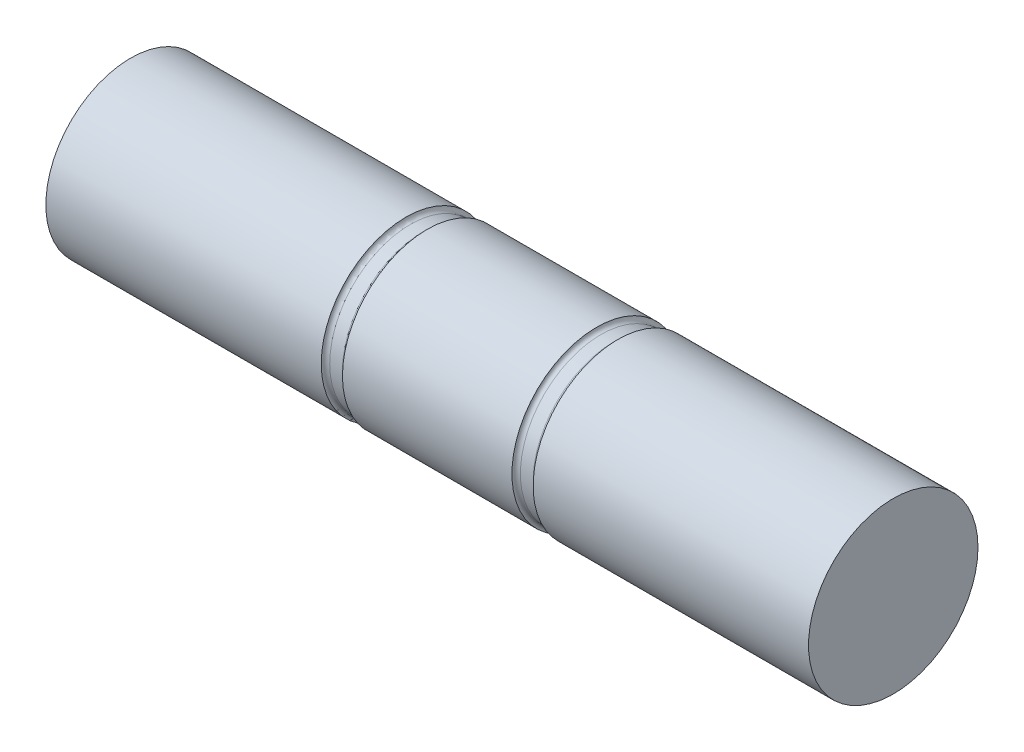
ISO-10303-21;
HEADER;
FILE_DESCRIPTION(('STEP AP214'),'2;1');
FILE_NAME('part.step','',(''),(''),'','','');
FILE_SCHEMA(('AUTOMOTIVE_DESIGN { 1 0 10303 214 1 1 1 1 }'));
ENDSEC;
DATA;
#1=APPLICATION_CONTEXT('core data for automotive mechanical design processes');
#2=APPLICATION_PROTOCOL_DEFINITION('international standard','automotive_design',2000,#1);
#3=PRODUCT_CONTEXT('',#1,'mechanical');
#4=PRODUCT('Part','Part','',(#3));
#5=PRODUCT_RELATED_PRODUCT_CATEGORY('part','',(#4));
#6=PRODUCT_DEFINITION_FORMATION('','',#4);
#7=PRODUCT_DEFINITION_CONTEXT('part definition',#1,'design');
#8=PRODUCT_DEFINITION('design','',#6,#7);
#9=PRODUCT_DEFINITION_SHAPE('','',#8);
#10=(LENGTH_UNIT() NAMED_UNIT(*) SI_UNIT(.MILLI.,.METRE.));
#11=(NAMED_UNIT(*) PLANE_ANGLE_UNIT() SI_UNIT($,.RADIAN.));
#12=(NAMED_UNIT(*) SI_UNIT($,.STERADIAN.) SOLID_ANGLE_UNIT());
#13=UNCERTAINTY_MEASURE_WITH_UNIT(LENGTH_MEASURE(1.E-05),#10,'distance_accuracy_value','');
#14=(GEOMETRIC_REPRESENTATION_CONTEXT(3) GLOBAL_UNCERTAINTY_ASSIGNED_CONTEXT((#13)) GLOBAL_UNIT_ASSIGNED_CONTEXT((#10,
#11,#12)) REPRESENTATION_CONTEXT('',''));
#15=CARTESIAN_POINT('',(0.,0.,0.));
#16=DIRECTION('',(0.,0.,1.));
#17=DIRECTION('',(1.,0.,0.));
#18=AXIS2_PLACEMENT_3D('',#15,#16,#17);
#19=CARTESIAN_POINT('',(18.,0.,0.));
#20=DIRECTION('',(-1.,0.,0.));
#21=DIRECTION('',(0.,0.,1.));
#22=AXIS2_PLACEMENT_3D('',#19,#20,#21);
#23=CYLINDRICAL_SURFACE('',#22,2.);
#24=CARTESIAN_POINT('',(11.,0.,0.));
#25=DIRECTION('',(1.,0.,0.));
#26=DIRECTION('',(0.,0.,-1.));
#27=AXIS2_PLACEMENT_3D('',#24,#25,#26);
#28=CIRCLE('',#27,2.);
#29=CARTESIAN_POINT('',(11.,0.,-2.));
#30=VERTEX_POINT('',#29);
#31=EDGE_CURVE('E78',#30,#30,#28,.T.);
#32=ORIENTED_EDGE('',*,*,#31,.F.);
#33=EDGE_LOOP('',(#32));
#34=FACE_BOUND('',#33,.T.);
#35=CARTESIAN_POINT('',(7.,0.,0.));
#36=DIRECTION('',(1.,0.,0.));
#37=DIRECTION('',(0.,0.,-1.));
#38=AXIS2_PLACEMENT_3D('',#35,#36,#37);
#39=CIRCLE('',#38,2.);
#40=CARTESIAN_POINT('',(7.,0.,-2.));
#41=VERTEX_POINT('',#40);
#42=EDGE_CURVE('E86',#41,#41,#39,.T.);
#43=ORIENTED_EDGE('',*,*,#42,.T.);
#44=EDGE_LOOP('',(#43));
#45=FACE_BOUND('',#44,.T.);
#46=ADVANCED_FACE('F45',(#34,#45),#23,.T.);
#47=CARTESIAN_POINT('',(11.,0.,0.));
#48=DIRECTION('',(1.,0.,0.));
#49=DIRECTION('',(0.,0.,-1.));
#50=AXIS2_PLACEMENT_3D('',#47,#48,#49);
#51=CYLINDRICAL_SURFACE('',#50,1.9);
#52=CARTESIAN_POINT('',(11.1,0.,0.));
#53=DIRECTION('',(1.,0.,0.));
#54=DIRECTION('',(0.,0.,-1.));
#55=AXIS2_PLACEMENT_3D('',#52,#53,#54);
#56=CIRCLE('',#55,1.9);
#57=CARTESIAN_POINT('',(11.1,0.,-1.9));
#58=VERTEX_POINT('',#57);
#59=EDGE_CURVE('E10',#58,#58,#56,.T.);
#60=ORIENTED_EDGE('',*,*,#59,.T.);
#61=EDGE_LOOP('',(#60));
#62=FACE_BOUND('',#61,.T.);
#63=CARTESIAN_POINT('',(11.4,0.,0.));
#64=DIRECTION('',(1.,0.,0.));
#65=DIRECTION('',(0.,0.,-1.));
#66=AXIS2_PLACEMENT_3D('',#63,#64,#65);
#67=CIRCLE('',#66,1.9);
#68=CARTESIAN_POINT('',(11.4,0.,-1.9));
#69=VERTEX_POINT('',#68);
#70=EDGE_CURVE('E53',#69,#69,#67,.F.);
#71=ORIENTED_EDGE('',*,*,#70,.T.);
#72=EDGE_LOOP('',(#71));
#73=FACE_BOUND('',#72,.T.);
#74=ADVANCED_FACE('F121',(#62,#73),#51,.T.);
#75=CARTESIAN_POINT('',(18.,0.,0.));
#76=DIRECTION('',(1.,0.,0.));
#77=DIRECTION('',(0.,0.,-1.));
#78=AXIS2_PLACEMENT_3D('',#75,#76,#77);
#79=PLANE('',#78);
#80=CARTESIAN_POINT('',(18.,0.,0.));
#81=DIRECTION('',(1.,0.,0.));
#82=DIRECTION('',(0.,0.,-1.));
#83=AXIS2_PLACEMENT_3D('',#80,#81,#82);
#84=CIRCLE('',#83,2.);
#85=CARTESIAN_POINT('',(18.,0.,-2.));
#86=VERTEX_POINT('',#85);
#87=EDGE_CURVE('E73',#86,#86,#84,.T.);
#88=ORIENTED_EDGE('',*,*,#87,.T.);
#89=EDGE_LOOP('',(#88));
#90=FACE_BOUND('',#89,.T.);
#91=ADVANCED_FACE('F127',(#90),#79,.T.);
#92=CARTESIAN_POINT('',(11.5,0.,0.));
#93=DIRECTION('',(1.,0.,0.));
#94=DIRECTION('',(0.,0.,-1.));
#95=AXIS2_PLACEMENT_3D('',#92,#93,#94);
#96=CIRCLE('',#95,2.);
#97=CARTESIAN_POINT('',(11.5,0.,-2.));
#98=VERTEX_POINT('',#97);
#99=EDGE_CURVE('E82',#98,#98,#96,.T.);
#100=ORIENTED_EDGE('',*,*,#99,.T.);
#101=EDGE_LOOP('',(#100));
#102=FACE_BOUND('',#101,.T.);
#103=ORIENTED_EDGE('',*,*,#87,.F.);
#104=EDGE_LOOP('',(#103));
#105=FACE_BOUND('',#104,.T.);
#106=ADVANCED_FACE('F118',(#102,#105),#23,.T.);
#107=CARTESIAN_POINT('',(7.,0.,0.));
#108=DIRECTION('',(-1.,0.,0.));
#109=DIRECTION('',(0.,0.,1.));
#110=AXIS2_PLACEMENT_3D('',#107,#108,#109);
#111=CYLINDRICAL_SURFACE('',#110,1.9);
#112=CARTESIAN_POINT('',(6.9,0.,0.));
#113=DIRECTION('',(-1.,0.,0.));
#114=DIRECTION('',(0.,0.,1.));
#115=AXIS2_PLACEMENT_3D('',#112,#113,#114);
#116=CIRCLE('',#115,1.9);
#117=CARTESIAN_POINT('',(6.9,0.,1.9));
#118=VERTEX_POINT('',#117);
#119=EDGE_CURVE('E60',#118,#118,#116,.T.);
#120=ORIENTED_EDGE('',*,*,#119,.T.);
#121=EDGE_LOOP('',(#120));
#122=FACE_BOUND('',#121,.T.);
#123=CARTESIAN_POINT('',(6.6,0.,0.));
#124=DIRECTION('',(-1.,0.,0.));
#125=DIRECTION('',(0.,0.,1.));
#126=AXIS2_PLACEMENT_3D('',#123,#124,#125);
#127=CIRCLE('',#126,1.9);
#128=CARTESIAN_POINT('',(6.6,0.,1.9));
#129=VERTEX_POINT('',#128);
#130=EDGE_CURVE('E67',#129,#129,#127,.F.);
#131=ORIENTED_EDGE('',*,*,#130,.T.);
#132=EDGE_LOOP('',(#131));
#133=FACE_BOUND('',#132,.T.);
#134=ADVANCED_FACE('F131',(#122,#133),#111,.T.);
#135=CARTESIAN_POINT('',(0.,0.,0.));
#136=DIRECTION('',(1.,0.,0.));
#137=DIRECTION('',(0.,0.,-1.));
#138=AXIS2_PLACEMENT_3D('',#135,#136,#137);
#139=PLANE('',#138);
#140=CARTESIAN_POINT('',(0.,0.,0.));
#141=DIRECTION('',(1.,0.,0.));
#142=DIRECTION('',(0.,0.,-1.));
#143=AXIS2_PLACEMENT_3D('',#140,#141,#142);
#144=CIRCLE('',#143,2.);
#145=CARTESIAN_POINT('',(0.,0.,-2.));
#146=VERTEX_POINT('',#145);
#147=EDGE_CURVE('E74',#146,#146,#144,.T.);
#148=ORIENTED_EDGE('',*,*,#147,.F.);
#149=EDGE_LOOP('',(#148));
#150=FACE_BOUND('',#149,.T.);
#151=ADVANCED_FACE('F115',(#150),#139,.F.);
#152=CARTESIAN_POINT('',(6.5,0.,0.));
#153=DIRECTION('',(1.,0.,0.));
#154=DIRECTION('',(0.,0.,-1.));
#155=AXIS2_PLACEMENT_3D('',#152,#153,#154);
#156=CIRCLE('',#155,2.);
#157=CARTESIAN_POINT('',(6.5,0.,-2.));
#158=VERTEX_POINT('',#157);
#159=EDGE_CURVE('E90',#158,#158,#156,.T.);
#160=ORIENTED_EDGE('',*,*,#159,.F.);
#161=EDGE_LOOP('',(#160));
#162=FACE_BOUND('',#161,.T.);
#163=ORIENTED_EDGE('',*,*,#147,.T.);
#164=EDGE_LOOP('',(#163));
#165=FACE_BOUND('',#164,.T.);
#166=ADVANCED_FACE('F104',(#162,#165),#23,.T.);
#167=CARTESIAN_POINT('',(6.9,0.,0.));
#168=DIRECTION('',(-1.,0.,0.));
#169=DIRECTION('',(0.,0.,1.));
#170=AXIS2_PLACEMENT_3D('',#167,#168,#169);
#171=TOROIDAL_SURFACE('',#170,2.,0.1);
#172=ORIENTED_EDGE('',*,*,#119,.F.);
#173=EDGE_LOOP('',(#172));
#174=FACE_BOUND('',#173,.T.);
#175=ORIENTED_EDGE('',*,*,#42,.F.);
#176=EDGE_LOOP('',(#175));
#177=FACE_BOUND('',#176,.T.);
#178=ADVANCED_FACE('F101',(#174,#177),#171,.F.);
#179=CARTESIAN_POINT('',(6.6,0.,0.));
#180=DIRECTION('',(-1.,0.,0.));
#181=DIRECTION('',(0.,0.,1.));
#182=AXIS2_PLACEMENT_3D('',#179,#180,#181);
#183=TOROIDAL_SURFACE('',#182,2.,0.1);
#184=ORIENTED_EDGE('',*,*,#159,.T.);
#185=EDGE_LOOP('',(#184));
#186=FACE_BOUND('',#185,.T.);
#187=ORIENTED_EDGE('',*,*,#130,.F.);
#188=EDGE_LOOP('',(#187));
#189=FACE_BOUND('',#188,.T.);
#190=ADVANCED_FACE('F103',(#186,#189),#183,.F.);
#191=CARTESIAN_POINT('',(11.1,0.,0.));
#192=DIRECTION('',(1.,0.,0.));
#193=DIRECTION('',(0.,0.,-1.));
#194=AXIS2_PLACEMENT_3D('',#191,#192,#193);
#195=TOROIDAL_SURFACE('',#194,2.,0.1);
#196=ORIENTED_EDGE('',*,*,#31,.T.);
#197=EDGE_LOOP('',(#196));
#198=FACE_BOUND('',#197,.T.);
#199=ORIENTED_EDGE('',*,*,#59,.F.);
#200=EDGE_LOOP('',(#199));
#201=FACE_BOUND('',#200,.T.);
#202=ADVANCED_FACE('F111',(#198,#201),#195,.F.);
#203=CARTESIAN_POINT('',(11.4,0.,0.));
#204=DIRECTION('',(1.,0.,0.));
#205=DIRECTION('',(0.,0.,-1.));
#206=AXIS2_PLACEMENT_3D('',#203,#204,#205);
#207=TOROIDAL_SURFACE('',#206,2.,0.1);
#208=ORIENTED_EDGE('',*,*,#70,.F.);
#209=EDGE_LOOP('',(#208));
#210=FACE_BOUND('',#209,.T.);
#211=ORIENTED_EDGE('',*,*,#99,.F.);
#212=EDGE_LOOP('',(#211));
#213=FACE_BOUND('',#212,.T.);
#214=ADVANCED_FACE('F47',(#210,#213),#207,.F.);
#215=CLOSED_SHELL('',(#46,#74,#91,#106,#134,#151,#166,#178,#190,#202,#214));
#216=MANIFOLD_SOLID_BREP('B2',#215);
#217=ADVANCED_BREP_SHAPE_REPRESENTATION('',(#18,#216),#14);
#218=SHAPE_DEFINITION_REPRESENTATION(#9,#217);
ENDSEC;
END-ISO-10303-21;
